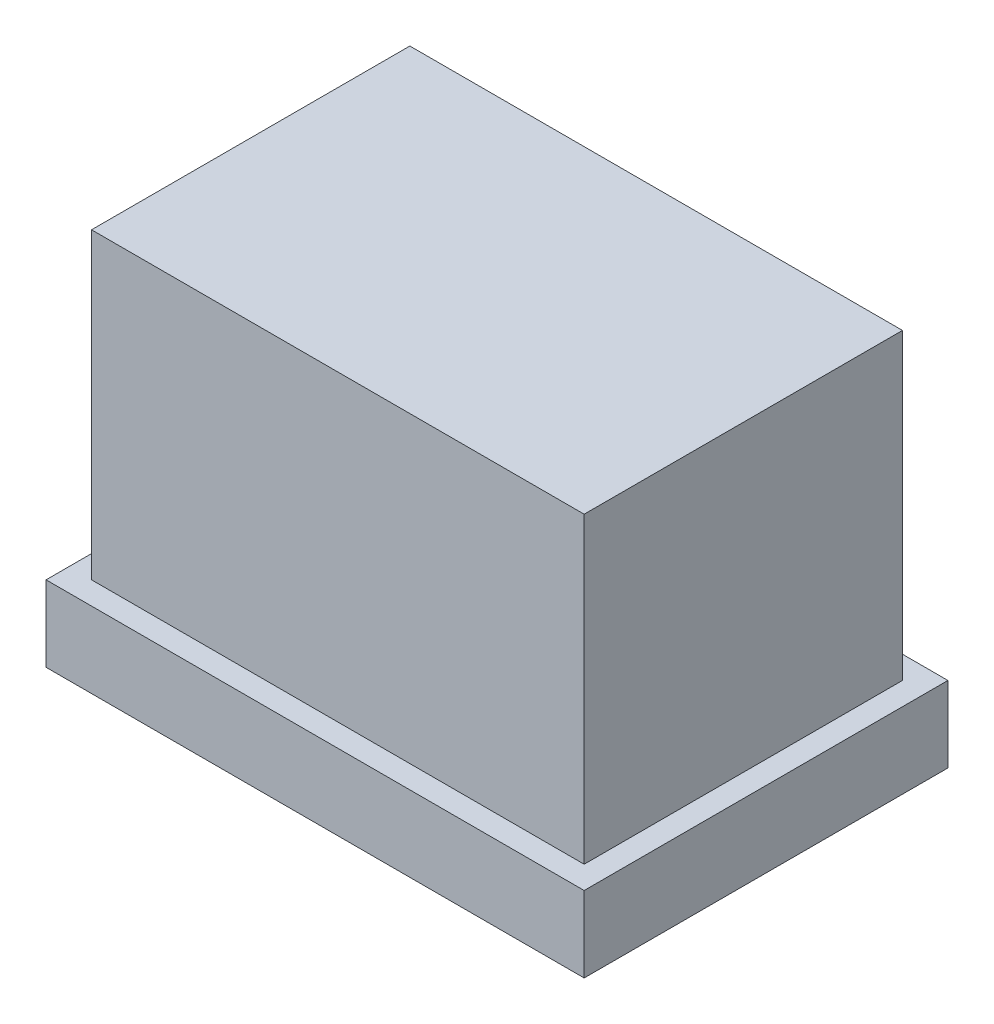
ISO-10303-21;
HEADER;
FILE_DESCRIPTION(('STEP AP214'),'2;1');
FILE_NAME('part.step','',(''),(''),'','','');
FILE_SCHEMA(('AUTOMOTIVE_DESIGN { 1 0 10303 214 1 1 1 1 }'));
ENDSEC;
DATA;
#1=APPLICATION_CONTEXT('core data for automotive mechanical design processes');
#2=APPLICATION_PROTOCOL_DEFINITION('international standard','automotive_design',2000,#1);
#3=PRODUCT_CONTEXT('',#1,'mechanical');
#4=PRODUCT('Part','Part','',(#3));
#5=PRODUCT_RELATED_PRODUCT_CATEGORY('part','',(#4));
#6=PRODUCT_DEFINITION_FORMATION('','',#4);
#7=PRODUCT_DEFINITION_CONTEXT('part definition',#1,'design');
#8=PRODUCT_DEFINITION('design','',#6,#7);
#9=PRODUCT_DEFINITION_SHAPE('','',#8);
#10=(LENGTH_UNIT() NAMED_UNIT(*) SI_UNIT(.MILLI.,.METRE.));
#11=(NAMED_UNIT(*) PLANE_ANGLE_UNIT() SI_UNIT($,.RADIAN.));
#12=(NAMED_UNIT(*) SI_UNIT($,.STERADIAN.) SOLID_ANGLE_UNIT());
#13=UNCERTAINTY_MEASURE_WITH_UNIT(LENGTH_MEASURE(1.E-05),#10,'distance_accuracy_value','');
#14=(GEOMETRIC_REPRESENTATION_CONTEXT(3) GLOBAL_UNCERTAINTY_ASSIGNED_CONTEXT((#13)) GLOBAL_UNIT_ASSIGNED_CONTEXT((#10,
#11,#12)) REPRESENTATION_CONTEXT('',''));
#15=CARTESIAN_POINT('',(0.,0.,0.));
#16=DIRECTION('',(0.,0.,1.));
#17=DIRECTION('',(1.,0.,0.));
#18=AXIS2_PLACEMENT_3D('',#15,#16,#17);
#19=CARTESIAN_POINT('',(-0.6,-2.,0.));
#20=DIRECTION('',(1.,0.,0.));
#21=DIRECTION('',(0.,0.,-1.));
#22=AXIS2_PLACEMENT_3D('',#19,#20,#21);
#23=PLANE('',#22);
#24=DIRECTION('',(0.,0.,-1.));
#25=VECTOR('',#24,1.);
#26=CARTESIAN_POINT('',(-0.6,0.,0.));
#27=LINE('',#26,#25);
#28=CARTESIAN_POINT('',(-0.6,0.,0.6));
#29=VERTEX_POINT('',#28);
#30=CARTESIAN_POINT('',(-0.6,0.,-9.));
#31=VERTEX_POINT('',#30);
#32=EDGE_CURVE('E109',#29,#31,#27,.T.);
#33=ORIENTED_EDGE('',*,*,#32,.T.);
#34=DIRECTION('',(0.,1.,0.));
#35=VECTOR('',#34,1.);
#36=CARTESIAN_POINT('',(-0.6,-2.,-9.));
#37=LINE('',#36,#35);
#38=CARTESIAN_POINT('',(-0.6,-2.,-9.));
#39=VERTEX_POINT('',#38);
#40=EDGE_CURVE('E12',#39,#31,#37,.T.);
#41=ORIENTED_EDGE('',*,*,#40,.F.);
#42=DIRECTION('',(0.,0.,-1.));
#43=VECTOR('',#42,1.);
#44=CARTESIAN_POINT('',(-0.6,-2.,0.));
#45=LINE('',#44,#43);
#46=CARTESIAN_POINT('',(-0.6,-2.,0.6));
#47=VERTEX_POINT('',#46);
#48=EDGE_CURVE('E104',#47,#39,#45,.T.);
#49=ORIENTED_EDGE('',*,*,#48,.F.);
#50=DIRECTION('',(0.,1.,0.));
#51=VECTOR('',#50,1.);
#52=CARTESIAN_POINT('',(-0.6,-2.,0.6));
#53=LINE('',#52,#51);
#54=EDGE_CURVE('E48',#47,#29,#53,.T.);
#55=ORIENTED_EDGE('',*,*,#54,.T.);
#56=EDGE_LOOP('',(#33,#41,#49,#55));
#57=FACE_BOUND('',#56,.T.);
#58=ADVANCED_FACE('F45',(#57),#23,.F.);
#59=CARTESIAN_POINT('',(0.,-2.,-9.));
#60=DIRECTION('',(0.,0.,1.));
#61=DIRECTION('',(1.,0.,0.));
#62=AXIS2_PLACEMENT_3D('',#59,#60,#61);
#63=PLANE('',#62);
#64=DIRECTION('',(1.,0.,0.));
#65=VECTOR('',#64,1.);
#66=CARTESIAN_POINT('',(0.,0.,-9.));
#67=LINE('',#66,#65);
#68=CARTESIAN_POINT('',(13.6,0.,-9.));
#69=VERTEX_POINT('',#68);
#70=EDGE_CURVE('E84',#31,#69,#67,.T.);
#71=ORIENTED_EDGE('',*,*,#70,.T.);
#72=DIRECTION('',(0.,1.,0.));
#73=VECTOR('',#72,1.);
#74=CARTESIAN_POINT('',(13.6,-2.,-9.));
#75=LINE('',#74,#73);
#76=CARTESIAN_POINT('',(13.6,-2.,-9.));
#77=VERTEX_POINT('',#76);
#78=EDGE_CURVE('E54',#77,#69,#75,.T.);
#79=ORIENTED_EDGE('',*,*,#78,.F.);
#80=DIRECTION('',(1.,0.,0.));
#81=VECTOR('',#80,1.);
#82=CARTESIAN_POINT('',(0.,-2.,-9.));
#83=LINE('',#82,#81);
#84=EDGE_CURVE('E62',#39,#77,#83,.T.);
#85=ORIENTED_EDGE('',*,*,#84,.F.);
#86=ORIENTED_EDGE('',*,*,#40,.T.);
#87=EDGE_LOOP('',(#71,#79,#85,#86));
#88=FACE_BOUND('',#87,.T.);
#89=ADVANCED_FACE('F116',(#88),#63,.F.);
#90=CARTESIAN_POINT('',(13.6,-2.,0.));
#91=DIRECTION('',(1.,0.,0.));
#92=DIRECTION('',(0.,0.,-1.));
#93=AXIS2_PLACEMENT_3D('',#90,#91,#92);
#94=PLANE('',#93);
#95=DIRECTION('',(0.,0.,-1.));
#96=VECTOR('',#95,1.);
#97=CARTESIAN_POINT('',(13.6,0.,0.));
#98=LINE('',#97,#96);
#99=CARTESIAN_POINT('',(13.6,0.,0.6));
#100=VERTEX_POINT('',#99);
#101=EDGE_CURVE('E96',#100,#69,#98,.T.);
#102=ORIENTED_EDGE('',*,*,#101,.F.);
#103=DIRECTION('',(0.,1.,0.));
#104=VECTOR('',#103,1.);
#105=CARTESIAN_POINT('',(13.6,-2.,0.6));
#106=LINE('',#105,#104);
#107=CARTESIAN_POINT('',(13.6,-2.,0.6));
#108=VERTEX_POINT('',#107);
#109=EDGE_CURVE('E92',#108,#100,#106,.T.);
#110=ORIENTED_EDGE('',*,*,#109,.F.);
#111=DIRECTION('',(0.,0.,-1.));
#112=VECTOR('',#111,1.);
#113=CARTESIAN_POINT('',(13.6,-2.,0.));
#114=LINE('',#113,#112);
#115=EDGE_CURVE('E95',#108,#77,#114,.T.);
#116=ORIENTED_EDGE('',*,*,#115,.T.);
#117=ORIENTED_EDGE('',*,*,#78,.T.);
#118=EDGE_LOOP('',(#102,#110,#116,#117));
#119=FACE_BOUND('',#118,.T.);
#120=ADVANCED_FACE('F94',(#119),#94,.T.);
#121=CARTESIAN_POINT('',(0.,-2.,0.6));
#122=DIRECTION('',(0.,0.,1.));
#123=DIRECTION('',(1.,0.,0.));
#124=AXIS2_PLACEMENT_3D('',#121,#122,#123);
#125=PLANE('',#124);
#126=DIRECTION('',(1.,0.,0.));
#127=VECTOR('',#126,1.);
#128=CARTESIAN_POINT('',(0.,0.,0.6));
#129=LINE('',#128,#127);
#130=EDGE_CURVE('E112',#29,#100,#129,.T.);
#131=ORIENTED_EDGE('',*,*,#130,.F.);
#132=ORIENTED_EDGE('',*,*,#54,.F.);
#133=DIRECTION('',(1.,0.,0.));
#134=VECTOR('',#133,1.);
#135=CARTESIAN_POINT('',(0.,-2.,0.6));
#136=LINE('',#135,#134);
#137=EDGE_CURVE('E101',#47,#108,#136,.T.);
#138=ORIENTED_EDGE('',*,*,#137,.T.);
#139=ORIENTED_EDGE('',*,*,#109,.T.);
#140=EDGE_LOOP('',(#131,#132,#138,#139));
#141=FACE_BOUND('',#140,.T.);
#142=ADVANCED_FACE('F103',(#141),#125,.T.);
#143=CARTESIAN_POINT('',(0.,-2.,0.));
#144=DIRECTION('',(0.,1.,0.));
#145=DIRECTION('',(0.,0.,1.));
#146=AXIS2_PLACEMENT_3D('',#143,#144,#145);
#147=PLANE('',#146);
#148=ORIENTED_EDGE('',*,*,#48,.T.);
#149=ORIENTED_EDGE('',*,*,#84,.T.);
#150=ORIENTED_EDGE('',*,*,#115,.F.);
#151=ORIENTED_EDGE('',*,*,#137,.F.);
#152=EDGE_LOOP('',(#148,#149,#150,#151));
#153=FACE_BOUND('',#152,.T.);
#154=ADVANCED_FACE('F100',(#153),#147,.F.);
#155=CARTESIAN_POINT('',(0.,0.,0.));
#156=DIRECTION('',(0.,1.,0.));
#157=DIRECTION('',(0.,0.,1.));
#158=AXIS2_PLACEMENT_3D('',#155,#156,#157);
#159=PLANE('',#158);
#160=ORIENTED_EDGE('',*,*,#32,.F.);
#161=ORIENTED_EDGE('',*,*,#130,.T.);
#162=ORIENTED_EDGE('',*,*,#101,.T.);
#163=ORIENTED_EDGE('',*,*,#70,.F.);
#164=EDGE_LOOP('',(#160,#161,#162,#163));
#165=FACE_BOUND('',#164,.T.);
#166=ADVANCED_FACE('F118',(#165),#159,.T.);
#167=CLOSED_SHELL('',(#58,#89,#120,#142,#154,#166));
#168=MANIFOLD_SOLID_BREP('B2',#167);
#169=CARTESIAN_POINT('',(0.,8.,-8.4));
#170=DIRECTION('',(0.,0.,-1.));
#171=DIRECTION('',(-1.,0.,0.));
#172=AXIS2_PLACEMENT_3D('',#169,#170,#171);
#173=PLANE('',#172);
#174=DIRECTION('',(1.,0.,0.));
#175=VECTOR('',#174,1.);
#176=CARTESIAN_POINT('',(0.,0.,-8.4));
#177=LINE('',#176,#175);
#178=CARTESIAN_POINT('',(0.,0.,-8.4));
#179=VERTEX_POINT('',#178);
#180=CARTESIAN_POINT('',(13.,0.,-8.4));
#181=VERTEX_POINT('',#180);
#182=EDGE_CURVE('E233',#179,#181,#177,.T.);
#183=ORIENTED_EDGE('',*,*,#182,.F.);
#184=DIRECTION('',(0.,-1.,0.));
#185=VECTOR('',#184,1.);
#186=CARTESIAN_POINT('',(0.,8.,-8.4));
#187=LINE('',#186,#185);
#188=CARTESIAN_POINT('',(0.,8.,-8.4));
#189=VERTEX_POINT('',#188);
#190=EDGE_CURVE('E43',#189,#179,#187,.T.);
#191=ORIENTED_EDGE('',*,*,#190,.F.);
#192=DIRECTION('',(1.,0.,0.));
#193=VECTOR('',#192,1.);
#194=CARTESIAN_POINT('',(0.,8.,-8.4));
#195=LINE('',#194,#193);
#196=CARTESIAN_POINT('',(13.,8.,-8.4));
#197=VERTEX_POINT('',#196);
#198=EDGE_CURVE('E227',#189,#197,#195,.T.);
#199=ORIENTED_EDGE('',*,*,#198,.T.);
#200=DIRECTION('',(0.,-1.,0.));
#201=VECTOR('',#200,1.);
#202=CARTESIAN_POINT('',(13.,8.,-8.4));
#203=LINE('',#202,#201);
#204=EDGE_CURVE('E172',#197,#181,#203,.T.);
#205=ORIENTED_EDGE('',*,*,#204,.T.);
#206=EDGE_LOOP('',(#183,#191,#199,#205));
#207=FACE_BOUND('',#206,.T.);
#208=ADVANCED_FACE('F169',(#207),#173,.T.);
#209=CARTESIAN_POINT('',(0.,8.,0.));
#210=DIRECTION('',(-1.,0.,0.));
#211=DIRECTION('',(0.,0.,1.));
#212=AXIS2_PLACEMENT_3D('',#209,#210,#211);
#213=PLANE('',#212);
#214=DIRECTION('',(0.,0.,-1.));
#215=VECTOR('',#214,1.);
#216=CARTESIAN_POINT('',(0.,0.,0.));
#217=LINE('',#216,#215);
#218=CARTESIAN_POINT('',(0.,0.,0.));
#219=VERTEX_POINT('',#218);
#220=EDGE_CURVE('E229',#219,#179,#217,.T.);
#221=ORIENTED_EDGE('',*,*,#220,.F.);
#222=DIRECTION('',(0.,-1.,0.));
#223=VECTOR('',#222,1.);
#224=CARTESIAN_POINT('',(0.,8.,0.));
#225=LINE('',#224,#223);
#226=CARTESIAN_POINT('',(0.,8.,0.));
#227=VERTEX_POINT('',#226);
#228=EDGE_CURVE('E178',#227,#219,#225,.T.);
#229=ORIENTED_EDGE('',*,*,#228,.F.);
#230=DIRECTION('',(0.,0.,-1.));
#231=VECTOR('',#230,1.);
#232=CARTESIAN_POINT('',(0.,8.,0.));
#233=LINE('',#232,#231);
#234=EDGE_CURVE('E217',#227,#189,#233,.T.);
#235=ORIENTED_EDGE('',*,*,#234,.T.);
#236=ORIENTED_EDGE('',*,*,#190,.T.);
#237=EDGE_LOOP('',(#221,#229,#235,#236));
#238=FACE_BOUND('',#237,.T.);
#239=ADVANCED_FACE('F243',(#238),#213,.T.);
#240=CARTESIAN_POINT('',(0.,8.,0.));
#241=DIRECTION('',(0.,0.,-1.));
#242=DIRECTION('',(-1.,0.,0.));
#243=AXIS2_PLACEMENT_3D('',#240,#241,#242);
#244=PLANE('',#243);
#245=DIRECTION('',(1.,0.,0.));
#246=VECTOR('',#245,1.);
#247=CARTESIAN_POINT('',(0.,0.,0.));
#248=LINE('',#247,#246);
#249=CARTESIAN_POINT('',(13.,0.,0.));
#250=VERTEX_POINT('',#249);
#251=EDGE_CURVE('E222',#219,#250,#248,.T.);
#252=ORIENTED_EDGE('',*,*,#251,.T.);
#253=DIRECTION('',(0.,-1.,0.));
#254=VECTOR('',#253,1.);
#255=CARTESIAN_POINT('',(13.,8.,0.));
#256=LINE('',#255,#254);
#257=CARTESIAN_POINT('',(13.,8.,0.));
#258=VERTEX_POINT('',#257);
#259=EDGE_CURVE('E220',#258,#250,#256,.T.);
#260=ORIENTED_EDGE('',*,*,#259,.F.);
#261=DIRECTION('',(1.,0.,0.));
#262=VECTOR('',#261,1.);
#263=CARTESIAN_POINT('',(0.,8.,0.));
#264=LINE('',#263,#262);
#265=EDGE_CURVE('E214',#227,#258,#264,.T.);
#266=ORIENTED_EDGE('',*,*,#265,.F.);
#267=ORIENTED_EDGE('',*,*,#228,.T.);
#268=EDGE_LOOP('',(#252,#260,#266,#267));
#269=FACE_BOUND('',#268,.T.);
#270=ADVANCED_FACE('F221',(#269),#244,.F.);
#271=CARTESIAN_POINT('',(13.,8.,0.));
#272=DIRECTION('',(-1.,0.,0.));
#273=DIRECTION('',(0.,0.,1.));
#274=AXIS2_PLACEMENT_3D('',#271,#272,#273);
#275=PLANE('',#274);
#276=DIRECTION('',(0.,0.,-1.));
#277=VECTOR('',#276,1.);
#278=CARTESIAN_POINT('',(13.,0.,0.));
#279=LINE('',#278,#277);
#280=EDGE_CURVE('E236',#250,#181,#279,.T.);
#281=ORIENTED_EDGE('',*,*,#280,.T.);
#282=ORIENTED_EDGE('',*,*,#204,.F.);
#283=DIRECTION('',(0.,0.,-1.));
#284=VECTOR('',#283,1.);
#285=CARTESIAN_POINT('',(13.,8.,0.));
#286=LINE('',#285,#284);
#287=EDGE_CURVE('E211',#258,#197,#286,.T.);
#288=ORIENTED_EDGE('',*,*,#287,.F.);
#289=ORIENTED_EDGE('',*,*,#259,.T.);
#290=EDGE_LOOP('',(#281,#282,#288,#289));
#291=FACE_BOUND('',#290,.T.);
#292=ADVANCED_FACE('F226',(#291),#275,.F.);
#293=CARTESIAN_POINT('',(0.,8.,0.));
#294=DIRECTION('',(0.,1.,0.));
#295=DIRECTION('',(0.,0.,1.));
#296=AXIS2_PLACEMENT_3D('',#293,#294,#295);
#297=PLANE('',#296);
#298=ORIENTED_EDGE('',*,*,#198,.F.);
#299=ORIENTED_EDGE('',*,*,#234,.F.);
#300=ORIENTED_EDGE('',*,*,#265,.T.);
#301=ORIENTED_EDGE('',*,*,#287,.T.);
#302=EDGE_LOOP('',(#298,#299,#300,#301));
#303=FACE_BOUND('',#302,.T.);
#304=ADVANCED_FACE('F216',(#303),#297,.T.);
#305=CARTESIAN_POINT('',(0.,0.,0.));
#306=DIRECTION('',(0.,1.,0.));
#307=DIRECTION('',(0.,0.,1.));
#308=AXIS2_PLACEMENT_3D('',#305,#306,#307);
#309=PLANE('',#308);
#310=ORIENTED_EDGE('',*,*,#182,.T.);
#311=ORIENTED_EDGE('',*,*,#280,.F.);
#312=ORIENTED_EDGE('',*,*,#251,.F.);
#313=ORIENTED_EDGE('',*,*,#220,.T.);
#314=EDGE_LOOP('',(#310,#311,#312,#313));
#315=FACE_BOUND('',#314,.T.);
#316=ADVANCED_FACE('F242',(#315),#309,.F.);
#317=CLOSED_SHELL('',(#208,#239,#270,#292,#304,#316));
#318=MANIFOLD_SOLID_BREP('B6',#317);
#319=ADVANCED_BREP_SHAPE_REPRESENTATION('',(#18,#168,#318),#14);
#320=SHAPE_DEFINITION_REPRESENTATION(#9,#319);
ENDSEC;
END-ISO-10303-21;
